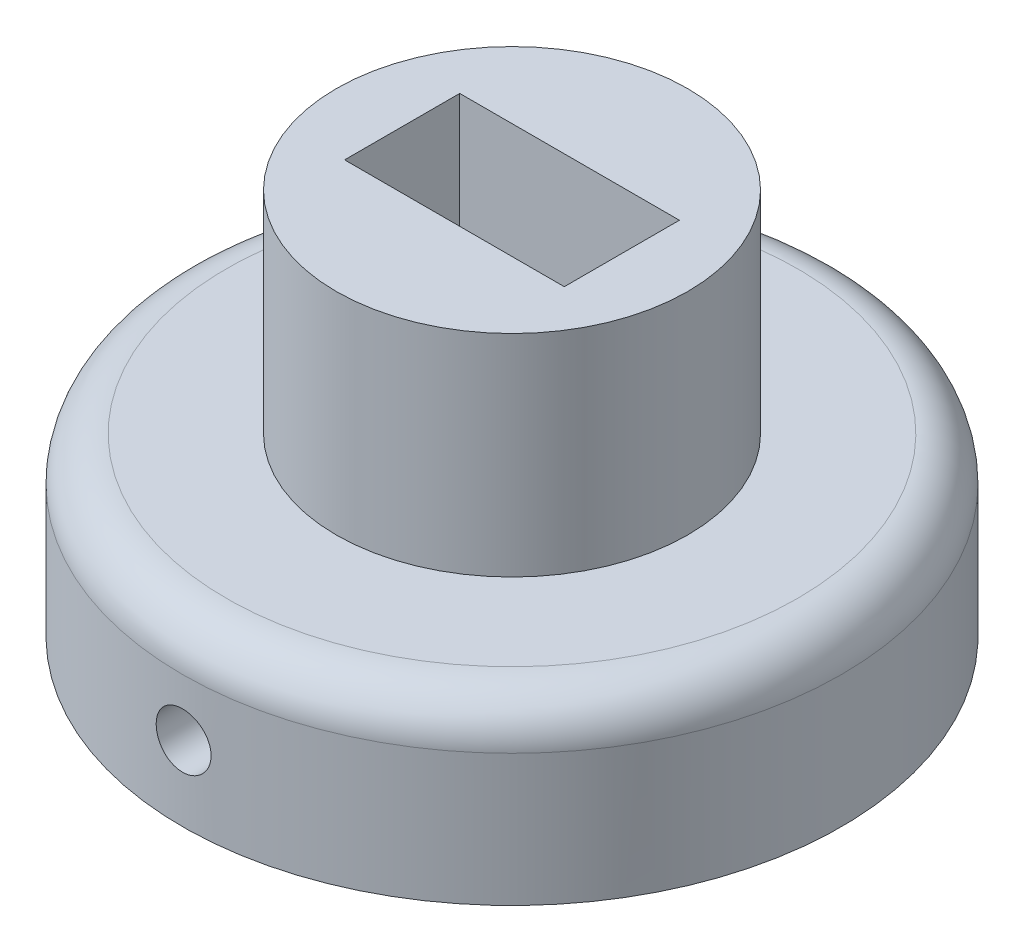
ISO-10303-21;
HEADER;
FILE_DESCRIPTION(('STEP AP214'),'2;1');
FILE_NAME('part.step','',(''),(''),'','','');
FILE_SCHEMA(('AUTOMOTIVE_DESIGN { 1 0 10303 214 1 1 1 1 }'));
ENDSEC;
DATA;
#1=APPLICATION_CONTEXT('core data for automotive mechanical design processes');
#2=APPLICATION_PROTOCOL_DEFINITION('international standard','automotive_design',2000,#1);
#3=PRODUCT_CONTEXT('',#1,'mechanical');
#4=PRODUCT('Part','Part','',(#3));
#5=PRODUCT_RELATED_PRODUCT_CATEGORY('part','',(#4));
#6=PRODUCT_DEFINITION_FORMATION('','',#4);
#7=PRODUCT_DEFINITION_CONTEXT('part definition',#1,'design');
#8=PRODUCT_DEFINITION('design','',#6,#7);
#9=PRODUCT_DEFINITION_SHAPE('','',#8);
#10=(LENGTH_UNIT() NAMED_UNIT(*) SI_UNIT(.MILLI.,.METRE.));
#11=(NAMED_UNIT(*) PLANE_ANGLE_UNIT() SI_UNIT($,.RADIAN.));
#12=(NAMED_UNIT(*) SI_UNIT($,.STERADIAN.) SOLID_ANGLE_UNIT());
#13=UNCERTAINTY_MEASURE_WITH_UNIT(LENGTH_MEASURE(1.E-05),#10,'distance_accuracy_value','');
#14=(GEOMETRIC_REPRESENTATION_CONTEXT(3) GLOBAL_UNCERTAINTY_ASSIGNED_CONTEXT((#13)) GLOBAL_UNIT_ASSIGNED_CONTEXT((#10,
#11,#12)) REPRESENTATION_CONTEXT('',''));
#15=CARTESIAN_POINT('',(0.,0.,0.));
#16=DIRECTION('',(0.,0.,1.));
#17=DIRECTION('',(1.,0.,0.));
#18=AXIS2_PLACEMENT_3D('',#15,#16,#17);
#19=CARTESIAN_POINT('',(0.,0.,0.));
#20=DIRECTION('',(0.,1.,0.));
#21=DIRECTION('',(-1.,0.,0.));
#22=AXIS2_PLACEMENT_3D('',#19,#20,#21);
#23=PLANE('',#22);
#24=DIRECTION('',(-0.500000000000001,0.,0.866025403784438));
#25=VECTOR('',#24,1.);
#26=CARTESIAN_POINT('',(6.45246660846326,0.,0.));
#27=LINE('',#26,#25);
#28=CARTESIAN_POINT('',(6.45246660846326,0.,0.));
#29=VERTEX_POINT('',#28);
#30=CARTESIAN_POINT('',(3.22623330423163,0.,5.588));
#31=VERTEX_POINT('',#30);
#32=EDGE_CURVE('E164',#29,#31,#27,.T.);
#33=ORIENTED_EDGE('',*,*,#32,.F.);
#34=DIRECTION('',(0.5,0.,0.866025403784439));
#35=VECTOR('',#34,1.);
#36=CARTESIAN_POINT('',(3.22623330423163,0.,-5.588));
#37=LINE('',#36,#35);
#38=CARTESIAN_POINT('',(3.22623330423163,0.,-5.588));
#39=VERTEX_POINT('',#38);
#40=EDGE_CURVE('E140',#39,#29,#37,.T.);
#41=ORIENTED_EDGE('',*,*,#40,.F.);
#42=DIRECTION('',(1.,0.,0.));
#43=VECTOR('',#42,1.);
#44=CARTESIAN_POINT('',(-3.22623330423163,0.,-5.588));
#45=LINE('',#44,#43);
#46=CARTESIAN_POINT('',(-3.22623330423163,0.,-5.588));
#47=VERTEX_POINT('',#46);
#48=EDGE_CURVE('E147',#47,#39,#45,.T.);
#49=ORIENTED_EDGE('',*,*,#48,.F.);
#50=DIRECTION('',(0.5,0.,-0.866025403784439));
#51=VECTOR('',#50,1.);
#52=CARTESIAN_POINT('',(-6.45246660846326,0.,0.));
#53=LINE('',#52,#51);
#54=CARTESIAN_POINT('',(-6.45246660846326,0.,0.));
#55=VERTEX_POINT('',#54);
#56=EDGE_CURVE('E173',#55,#47,#53,.T.);
#57=ORIENTED_EDGE('',*,*,#56,.F.);
#58=DIRECTION('',(-0.5,0.,-0.866025403784439));
#59=VECTOR('',#58,1.);
#60=CARTESIAN_POINT('',(-3.22623330423163,0.,5.588));
#61=LINE('',#60,#59);
#62=CARTESIAN_POINT('',(-3.22623330423163,0.,5.588));
#63=VERTEX_POINT('',#62);
#64=EDGE_CURVE('E170',#63,#55,#61,.T.);
#65=ORIENTED_EDGE('',*,*,#64,.F.);
#66=DIRECTION('',(-1.,0.,0.));
#67=VECTOR('',#66,1.);
#68=CARTESIAN_POINT('',(3.22623330423163,0.,5.588));
#69=LINE('',#68,#67);
#70=EDGE_CURVE('E167',#31,#63,#69,.T.);
#71=ORIENTED_EDGE('',*,*,#70,.F.);
#72=EDGE_LOOP('',(#33,#41,#49,#57,#65,#71));
#73=FACE_BOUND('',#72,.T.);
#74=CARTESIAN_POINT('',(0.,0.,0.));
#75=DIRECTION('',(0.,1.,0.));
#76=DIRECTION('',(-1.,0.,0.));
#77=AXIS2_PLACEMENT_3D('',#74,#75,#76);
#78=CIRCLE('',#77,9.525);
#79=CARTESIAN_POINT('',(-9.525,0.,0.));
#80=VERTEX_POINT('',#79);
#81=EDGE_CURVE('E196',#80,#80,#78,.T.);
#82=ORIENTED_EDGE('',*,*,#81,.F.);
#83=EDGE_LOOP('',(#82));
#84=FACE_BOUND('',#83,.T.);
#85=ADVANCED_FACE('F37',(#73,#84),#23,.F.);
#86=CARTESIAN_POINT('',(0.,11.176,0.));
#87=DIRECTION('',(0.,1.,0.));
#88=DIRECTION('',(-1.,0.,0.));
#89=AXIS2_PLACEMENT_3D('',#86,#87,#88);
#90=CYLINDRICAL_SURFACE('',#89,9.525);
#91=CARTESIAN_POINT('',(0.,3.80999999999997,0.));
#92=DIRECTION('',(0.,-1.,0.));
#93=DIRECTION('',(1.,0.,0.));
#94=AXIS2_PLACEMENT_3D('',#91,#92,#93);
#95=CIRCLE('',#94,9.525);
#96=CARTESIAN_POINT('',(9.525,3.80999999999997,0.));
#97=VERTEX_POINT('',#96);
#98=EDGE_CURVE('E11',#97,#97,#95,.T.);
#99=ORIENTED_EDGE('',*,*,#98,.T.);
#100=EDGE_LOOP('',(#99));
#101=FACE_BOUND('',#100,.T.);
#102=CARTESIAN_POINT('',(0.,2.95275,-9.525));
#103=CARTESIAN_POINT('',(-0.0445024588749559,2.95274805624414,-9.52499956670391));
#104=CARTESIAN_POINT('',(-0.0890352130743041,2.94899479271248,-9.52468479031321));
#105=CARTESIAN_POINT('',(-0.176868590493434,2.93407754571503,-9.52345934973048));
#106=CARTESIAN_POINT('',(-0.220167759772526,2.92290516644548,-9.52254801045783));
#107=CARTESIAN_POINT('',(-0.304249155370695,2.89347500916381,-9.52023242989095));
#108=CARTESIAN_POINT('',(-0.345032790712039,2.87522124018783,-9.51882846753173));
#109=CARTESIAN_POINT('',(-0.42294749152401,2.8321536322016,-9.51568508772365));
#110=CARTESIAN_POINT('',(-0.460079335971527,2.80734119642723,-9.51394574205203));
#111=CARTESIAN_POINT('',(-0.529740812472688,2.75179229088149,-9.51032181519203));
#112=CARTESIAN_POINT('',(-0.562259854980328,2.72104256087605,-9.5084369146872));
#113=CARTESIAN_POINT('',(-0.62168177474464,2.65451995141912,-9.50473699762515));
#114=CARTESIAN_POINT('',(-0.648584405276133,2.61874685140979,-9.50292198414087));
#115=CARTESIAN_POINT('',(-0.696045663397244,2.54312886955265,-9.49956390549861));
#116=CARTESIAN_POINT('',(-0.716594986155287,2.50327812827405,-9.49802124061698));
#117=CARTESIAN_POINT('',(-0.750706869307989,2.42067691540244,-9.49538617530817));
#118=CARTESIAN_POINT('',(-0.764269553112981,2.37792649504376,-9.49429376692783));
#119=CARTESIAN_POINT('',(-0.78399245491849,2.29084553269432,-9.49268558077643));
#120=CARTESIAN_POINT('',(-0.790169921903133,2.24651892263087,-9.49216845955624));
#121=CARTESIAN_POINT('',(-0.795000321362246,2.15745520061837,-9.49176515030172));
#122=CARTESIAN_POINT('',(-0.793653395052509,2.11271809638908,-9.49187895042641));
#123=CARTESIAN_POINT('',(-0.783487498470536,2.02422151550102,-9.492723405308));
#124=CARTESIAN_POINT('',(-0.774687274630208,1.9804598685456,-9.49345251243671));
#125=CARTESIAN_POINT('',(-0.749893713397709,1.89503695525684,-9.49544300083183));
#126=CARTESIAN_POINT('',(-0.733900305752448,1.85337570944175,-9.49670438729682));
#127=CARTESIAN_POINT('',(-0.695153381845676,1.77327646845926,-9.49961908736064));
#128=CARTESIAN_POINT('',(-0.672391454901022,1.73484256028992,-9.50127288806078));
#129=CARTESIAN_POINT('',(-0.62075968360622,1.66233368731178,-9.50478562323205));
#130=CARTESIAN_POINT('',(-0.591889715556642,1.62825881080409,-9.50664456185725));
#131=CARTESIAN_POINT('',(-0.528756230892175,1.56532626094526,-9.51036499951743));
#132=CARTESIAN_POINT('',(-0.494476507703769,1.53648484284741,-9.51222648902709));
#133=CARTESIAN_POINT('',(-0.421553129120077,1.48496359456034,-9.51573687296681));
#134=CARTESIAN_POINT('',(-0.382909470809049,1.46228376848799,-9.51738576725483));
#135=CARTESIAN_POINT('',(-0.302344608406357,1.42373051338171,-9.52028548861401));
#136=CARTESIAN_POINT('',(-0.260423058185952,1.40785780429546,-9.52153627357596));
#137=CARTESIAN_POINT('',(-0.174497261034293,1.38338073236676,-9.52349836320615));
#138=CARTESIAN_POINT('',(-0.130493057346528,1.37477621867989,-9.52420967907053));
#139=CARTESIAN_POINT('',(-0.0417919695053741,1.365100168542,-9.52501124698546));
#140=CARTESIAN_POINT('',(0.00290244936018692,1.36400617937765,-9.52510335015527));
#141=CARTESIAN_POINT('',(0.0918390597994971,1.36932341437293,-9.52466105905593));
#142=CARTESIAN_POINT('',(0.136081255587622,1.37573456852588,-9.5241266706306));
#143=CARTESIAN_POINT('',(0.222793525253355,1.39586149152176,-9.52249268536548));
#144=CARTESIAN_POINT('',(0.265266031204654,1.40956685322049,-9.52139389387578));
#145=CARTESIAN_POINT('',(0.347308618534226,1.44388251655199,-9.51875453776679));
#146=CARTESIAN_POINT('',(0.386878654012236,1.46449292735393,-9.51721396616298));
#147=CARTESIAN_POINT('',(0.462095229527139,1.51209005844048,-9.51385913449945));
#148=CARTESIAN_POINT('',(0.497732328226416,1.53909165320089,-9.51204423961122));
#149=CARTESIAN_POINT('',(0.563976119032124,1.59868318903382,-9.5083467967026));
#150=CARTESIAN_POINT('',(0.594582723721417,1.63127322719911,-9.50646424750724));
#151=CARTESIAN_POINT('',(0.649973732954987,1.70121396818243,-9.50283819215059));
#152=CARTESIAN_POINT('',(0.6747434857542,1.73857629582544,-9.50109504300164));
#153=CARTESIAN_POINT('',(0.717657206128867,1.81694317114784,-9.49795020447055));
#154=CARTESIAN_POINT('',(0.735801239857908,1.85794768245726,-9.49654851167922));
#155=CARTESIAN_POINT('',(0.764923522093448,1.94238307749052,-9.49424729011346));
#156=CARTESIAN_POINT('',(0.775910739775374,1.985810849867,-9.49334713300228));
#157=CARTESIAN_POINT('',(0.790436704866184,2.07390261802532,-9.49214879642113));
#158=CARTESIAN_POINT('',(0.793975595313561,2.11856659005037,-9.49185060539094));
#159=CARTESIAN_POINT('',(0.793502796794676,2.20771730002909,-9.49189013122967));
#160=CARTESIAN_POINT('',(0.789514129135804,2.25220416274392,-9.49222590925124));
#161=CARTESIAN_POINT('',(0.77414744149043,2.33987382350599,-9.49349141971581));
#162=CARTESIAN_POINT('',(0.762769410233804,2.38305661956417,-9.49442115306469));
#163=CARTESIAN_POINT('',(0.732952806076043,2.46689384959288,-9.49676930598291));
#164=CARTESIAN_POINT('',(0.714514647617685,2.50754843181152,-9.49818769686663));
#165=CARTESIAN_POINT('',(0.671103765539379,2.58518885470535,-9.50135339275837));
#166=CARTESIAN_POINT('',(0.64613114448468,2.62217475295183,-9.50310069260369));
#167=CARTESIAN_POINT('',(0.590273729059693,2.69154571784158,-9.50673368285828));
#168=CARTESIAN_POINT('',(0.559371891907283,2.72391704124677,-9.50861976229559));
#169=CARTESIAN_POINT('',(0.49256412281402,2.78302655325513,-9.51231424788933));
#170=CARTESIAN_POINT('',(0.456656981846367,2.80976337691871,-9.51412263514079));
#171=CARTESIAN_POINT('',(0.380788682342098,2.85688076420644,-9.51746123906055));
#172=CARTESIAN_POINT('',(0.34082010216474,2.87724940380846,-9.51899093168339));
#173=CARTESIAN_POINT('',(0.258044753146613,2.91096049367195,-9.52159364184813));
#174=CARTESIAN_POINT('',(0.215241310859585,2.92431102040368,-9.52266718405553));
#175=CARTESIAN_POINT('',(0.143487813176739,2.940206831111,-9.52396104263744));
#176=CARTESIAN_POINT('',(0.114999209960536,2.94490426743576,-9.52434887796081));
#177=CARTESIAN_POINT('',(0.0576779798790479,2.95117647768128,-9.5248684967279));
#178=CARTESIAN_POINT('',(0.0288453539273546,2.95275125989276,-9.52500028085143));
#179=CARTESIAN_POINT('',(0.,2.95275,-9.525));
#180=B_SPLINE_CURVE_WITH_KNOTS('',3,(#102,#103,#104,#105,#106,#107,#108,#109,#110,#111,#112,
#113,#114,#115,#116,#117,#118,#119,#120,#121,#122,#123,#124,#125,#126,#127,#128,#129,#130,#131,
#132,#133,#134,#135,#136,#137,#138,#139,#140,#141,#142,#143,#144,#145,#146,#147,#148,#149,#150,
#151,#152,#153,#154,#155,#156,#157,#158,#159,#160,#161,#162,#163,#164,#165,#166,#167,#168,#169,
#170,#171,#172,#173,#174,#175,#176,#177,#178,#179),.UNSPECIFIED.,.T.,.F.,(4,2,2,2,2,2,2,2,2,2,2,
2,2,2,2,2,2,2,2,2,2,2,2,2,2,2,2,2,2,2,2,2,2,2,2,2,2,2,4),(0.,0.13340205952261,0.266955340642032,
0.400433122399358,0.533882369482444,0.667633180848701,0.801389866561832,0.935341529674287,
1.06929082661521,1.20292665522572,1.33655997580329,1.46985817843792,1.60315768297368,
1.73662352500689,1.87009207023558,2.00396832929775,2.13784467780924,2.2717351821242,
2.405622907602,2.53911020075065,2.67259624876288,2.80589235168186,2.93919056211839,
3.07280210761348,3.20641597469055,3.34036175089892,3.47430618970738,3.60808243997487,
3.74185612116514,3.87522134913006,4.0085867805017,4.14194438427096,4.27529989497823,
4.40904462252557,4.54282171215781,4.67684781118402,4.8107193329473,4.897187360456,
4.98365515839005),.UNSPECIFIED.);
#181=CARTESIAN_POINT('',(0.,2.95275,-9.525));
#182=VERTEX_POINT('',#181);
#183=EDGE_CURVE('E246',#182,#182,#180,.T.);
#184=ORIENTED_EDGE('',*,*,#183,.T.);
#185=EDGE_LOOP('',(#184));
#186=FACE_BOUND('',#185,.T.);
#187=CARTESIAN_POINT('',(0.79375,2.159,9.49186946483674));
#188=CARTESIAN_POINT('',(0.793748055971614,2.11449784364762,9.49186990376637));
#189=CARTESIAN_POINT('',(0.789994841743108,2.06996539098734,9.49218580336204));
#190=CARTESIAN_POINT('',(0.775077808390216,1.9821326401024,9.4934152567598));
#191=CARTESIAN_POINT('',(0.763905592424564,1.93883379605496,9.49432948773761));
#192=CARTESIAN_POINT('',(0.734475912885411,1.85475308807552,9.49665134174957));
#193=CARTESIAN_POINT('',(0.716222466123075,1.813969812367,9.49805868502322));
#194=CARTESIAN_POINT('',(0.673155616860331,1.73605571380213,9.50120784144409));
#195=CARTESIAN_POINT('',(0.648343616801324,1.69892411242006,9.50294958306382));
#196=CARTESIAN_POINT('',(0.592795150813565,1.62926236006585,9.50657630668715));
#197=CARTESIAN_POINT('',(0.56204532736274,1.59674287595877,9.50846160572916));
#198=CARTESIAN_POINT('',(0.495522345786649,1.53732010429857,9.51216011434801));
#199=CARTESIAN_POINT('',(0.459748968306357,1.51041706211673,9.51397332077246));
#200=CARTESIAN_POINT('',(0.384130744713852,1.46295537461665,9.51732634652841));
#201=CARTESIAN_POINT('',(0.344280086874901,1.44240595822472,9.51886576680833));
#202=CARTESIAN_POINT('',(0.261679055395893,1.40829387892469,9.52149435369253));
#203=CARTESIAN_POINT('',(0.218928732525328,1.39473109372517,9.5225835281777));
#204=CARTESIAN_POINT('',(0.131848063033575,1.37500797843927,9.52418668765556));
#205=CARTESIAN_POINT('',(0.0875216501344051,1.36883039104894,9.52470201339087));
#206=CARTESIAN_POINT('',(-0.00154168625004403,1.36399968247223,9.52510395532792));
#207=CARTESIAN_POINT('',(-0.0462786020860167,1.36534642136076,9.52499058322115));
#208=CARTESIAN_POINT('',(-0.134776012768059,1.37551202241738,9.5241490098204));
#209=CARTESIAN_POINT('',(-0.17853865587002,1.38431232678208,9.52342233553507));
#210=CARTESIAN_POINT('',(-0.263963519919445,1.40910639482616,9.52143764884605));
#211=CARTESIAN_POINT('',(-0.305625720878005,1.42510022694852,9.52017963138687));
#212=CARTESIAN_POINT('',(-0.385726115005505,1.46384802727536,9.51727116030383));
#213=CARTESIAN_POINT('',(-0.424160269485561,1.48661030671277,9.51562022470132));
#214=CARTESIAN_POINT('',(-0.496669485352663,1.53824282900303,9.51211144682469));
#215=CARTESIAN_POINT('',(-0.530744458297085,1.56711319575021,9.51025360035402));
#216=CARTESIAN_POINT('',(-0.593676553295631,1.63024696171448,9.50653312643144));
#217=CARTESIAN_POINT('',(-0.622517500727865,1.66452648648743,9.50467050161177));
#218=CARTESIAN_POINT('',(-0.674037894144897,1.73744930093608,9.50115608156825));
#219=CARTESIAN_POINT('',(-0.696717335050538,1.77609259420897,9.4995042865182));
#220=CARTESIAN_POINT('',(-0.735270313645894,1.85665736091887,9.49659824464482));
#221=CARTESIAN_POINT('',(-0.751143011883169,1.8985792379391,9.49534404686078));
#222=CARTESIAN_POINT('',(-0.775619961828879,1.98450574495298,9.49337615290986));
#223=CARTESIAN_POINT('',(-0.784224366345249,2.0285103311394,9.49266244537979));
#224=CARTESIAN_POINT('',(-0.79390000518689,2.11721159182826,9.49185818236624));
#225=CARTESIAN_POINT('',(-0.794993795231073,2.16190578972347,9.49176576106666));
#226=CARTESIAN_POINT('',(-0.789676240879327,2.25084191027189,9.49220960975968));
#227=CARTESIAN_POINT('',(-0.783264966486064,2.29508383713974,9.4927458738883));
#228=CARTESIAN_POINT('',(-0.763138079736218,2.38179479491589,9.49438496839893));
#229=CARTESIAN_POINT('',(-0.749432993597876,2.42426628585821,9.49548698222649));
#230=CARTESIAN_POINT('',(-0.715118221644935,2.50630696521747,9.49813272915068));
#231=CARTESIAN_POINT('',(-0.694508425041734,2.54587610705275,9.49967646933491));
#232=CARTESIAN_POINT('',(-0.64691219358329,2.62109208144904,9.50303625061403));
#233=CARTESIAN_POINT('',(-0.619910728112498,2.65672937379125,9.50485292981518));
#234=CARTESIAN_POINT('',(-0.560319339429809,2.7229736155948,9.50855173607938));
#235=CARTESIAN_POINT('',(-0.527729320054606,2.75358047847884,9.51043386426818));
#236=CARTESIAN_POINT('',(-0.457788464748696,2.80897203457997,9.51405705380132));
#237=CARTESIAN_POINT('',(-0.420426000975302,2.83374207269623,9.51579775302222));
#238=CARTESIAN_POINT('',(-0.342058778363933,2.87665629389186,9.51893673322652));
#239=CARTESIAN_POINT('',(-0.301054055928035,2.89480054318254,9.52033501763161));
#240=CARTESIAN_POINT('',(-0.216618803146336,2.92392297041776,9.52262995155359));
#241=CARTESIAN_POINT('',(-0.173191416475731,2.93491021089701,9.52352723525412));
#242=CARTESIAN_POINT('',(-0.0851004608838743,2.94943635231731,9.52472164243053));
#243=CARTESIAN_POINT('',(-0.040436915377776,2.95297539424344,9.52501877726648));
#244=CARTESIAN_POINT('',(0.0487140634142476,2.95250303294173,9.52497942499496));
#245=CARTESIAN_POINT('',(0.0932016203427882,2.94851446916566,9.52464485453844));
#246=CARTESIAN_POINT('',(0.180872695198684,2.93314774485647,9.52338347570212));
#247=CARTESIAN_POINT('',(0.224056211354773,2.92176957428658,9.52245666651792));
#248=CARTESIAN_POINT('',(0.307894868118696,2.89195242496537,9.52011479977499));
#249=CARTESIAN_POINT('',(0.348550155482956,2.87351385649541,9.51869977058731));
#250=CARTESIAN_POINT('',(0.426191817238599,2.83010193646559,9.51553976968878));
#251=CARTESIAN_POINT('',(0.463178249637058,2.80512868824614,9.51379480319573));
#252=CARTESIAN_POINT('',(0.532549170981458,2.74927058821354,9.51016448310669));
#253=CARTESIAN_POINT('',(0.564920031562788,2.71836883669368,9.50827873782952));
#254=CARTESIAN_POINT('',(0.624028649831638,2.65156142857377,9.50458272578044));
#255=CARTESIAN_POINT('',(0.650765041374533,2.6156545619217,9.50277247739882));
#256=CARTESIAN_POINT('',(0.697881969564467,2.53978648069363,9.49942874374388));
#257=CARTESIAN_POINT('',(0.718250502995158,2.49981779531152,9.49789578341389));
#258=CARTESIAN_POINT('',(0.7519613651162,2.4170422220919,9.49528660061675));
#259=CARTESIAN_POINT('',(0.765311771800265,2.37423866145632,9.49420985331826));
#260=CARTESIAN_POINT('',(0.781207240292331,2.30248548564467,9.49291192749276));
#261=CARTESIAN_POINT('',(0.785904522658884,2.27399734685701,9.49252280108811));
#262=CARTESIAN_POINT('',(0.792176528345911,2.21667704747996,9.49200142785512));
#263=CARTESIAN_POINT('',(0.793751260057608,2.18784488781526,9.49186918033646));
#264=CARTESIAN_POINT('',(0.79375,2.159,9.49186946483674));
#265=B_SPLINE_CURVE_WITH_KNOTS('',3,(#187,#188,#189,#190,#191,#192,#193,#194,#195,#196,#197,
#198,#199,#200,#201,#202,#203,#204,#205,#206,#207,#208,#209,#210,#211,#212,#213,#214,#215,#216,
#217,#218,#219,#220,#221,#222,#223,#224,#225,#226,#227,#228,#229,#230,#231,#232,#233,#234,#235,
#236,#237,#238,#239,#240,#241,#242,#243,#244,#245,#246,#247,#248,#249,#250,#251,#252,#253,#254,
#255,#256,#257,#258,#259,#260,#261,#262,#263,#264),.UNSPECIFIED.,.T.,.F.,(4,2,2,2,2,2,2,2,2,2,2,
2,2,2,2,2,2,2,2,2,2,2,2,2,2,2,2,2,2,2,2,2,2,2,2,2,2,2,4),(0.,0.133401150877659,
0.266953543369256,0.400430289099396,0.533878516025936,0.667630516314075,0.801388358741387,
0.935339587442498,1.06928847143099,1.2029237357373,1.3365565149222,1.46985755148967,
1.60315985638005,1.73662652897048,1.87009590901209,2.00397097318102,2.13784614770773,
2.27173782785988,2.40562669301565,2.53911328941239,2.67259864073745,2.80589187018534,
2.9391872384742,3.07279923319135,3.20641352722619,3.34035980816231,3.47430475054048,
3.60807975424297,3.74185222572935,3.87521947155307,4.0085868985201,4.14194657665058,
4.27530414593823,4.40904766781932,4.54282358020796,4.67685015652607,4.81072212611861,
4.89718875801907,4.98365515755762),.UNSPECIFIED.);
#266=CARTESIAN_POINT('',(0.79375,2.159,9.49186946483674));
#267=VERTEX_POINT('',#266);
#268=EDGE_CURVE('E240',#267,#267,#265,.T.);
#269=ORIENTED_EDGE('',*,*,#268,.T.);
#270=EDGE_LOOP('',(#269));
#271=FACE_BOUND('',#270,.T.);
#272=ORIENTED_EDGE('',*,*,#81,.T.);
#273=EDGE_LOOP('',(#272));
#274=FACE_BOUND('',#273,.T.);
#275=ADVANCED_FACE('F226',(#101,#186,#271,#274),#90,.T.);
#276=CARTESIAN_POINT('',(9.525,5.07999999999997,0.));
#277=DIRECTION('',(0.,-1.,0.));
#278=DIRECTION('',(1.,0.,0.));
#279=AXIS2_PLACEMENT_3D('',#276,#277,#278);
#280=PLANE('',#279);
#281=CARTESIAN_POINT('',(0.,5.07999999999997,0.));
#282=DIRECTION('',(0.,-1.,0.));
#283=DIRECTION('',(1.,0.,0.));
#284=AXIS2_PLACEMENT_3D('',#281,#282,#283);
#285=CIRCLE('',#284,8.255);
#286=CARTESIAN_POINT('',(8.255,5.07999999999997,0.));
#287=VERTEX_POINT('',#286);
#288=EDGE_CURVE('E45',#287,#287,#285,.F.);
#289=ORIENTED_EDGE('',*,*,#288,.T.);
#290=EDGE_LOOP('',(#289));
#291=FACE_BOUND('',#290,.T.);
#292=CARTESIAN_POINT('',(0.,5.07999999999997,0.));
#293=DIRECTION('',(0.,1.,0.));
#294=DIRECTION('',(-1.,0.,0.));
#295=AXIS2_PLACEMENT_3D('',#292,#293,#294);
#296=CIRCLE('',#295,5.08);
#297=CARTESIAN_POINT('',(-5.08,5.07999999999997,0.));
#298=VERTEX_POINT('',#297);
#299=EDGE_CURVE('E193',#298,#298,#296,.T.);
#300=ORIENTED_EDGE('',*,*,#299,.F.);
#301=EDGE_LOOP('',(#300));
#302=FACE_BOUND('',#301,.T.);
#303=ADVANCED_FACE('F212',(#291,#302),#280,.F.);
#304=CARTESIAN_POINT('',(0.,11.176,0.));
#305=DIRECTION('',(0.,1.,0.));
#306=DIRECTION('',(-1.,0.,0.));
#307=AXIS2_PLACEMENT_3D('',#304,#305,#306);
#308=CYLINDRICAL_SURFACE('',#307,5.08);
#309=CARTESIAN_POINT('',(0.,11.176,0.));
#310=DIRECTION('',(0.,1.,0.));
#311=DIRECTION('',(-1.,0.,0.));
#312=AXIS2_PLACEMENT_3D('',#309,#310,#311);
#313=CIRCLE('',#312,5.08);
#314=CARTESIAN_POINT('',(-5.08,11.176,0.));
#315=VERTEX_POINT('',#314);
#316=EDGE_CURVE('E180',#315,#315,#313,.T.);
#317=ORIENTED_EDGE('',*,*,#316,.F.);
#318=EDGE_LOOP('',(#317));
#319=FACE_BOUND('',#318,.T.);
#320=ORIENTED_EDGE('',*,*,#299,.T.);
#321=EDGE_LOOP('',(#320));
#322=FACE_BOUND('',#321,.T.);
#323=ADVANCED_FACE('F294',(#319,#322),#308,.T.);
#324=CARTESIAN_POINT('',(5.08,11.176,0.));
#325=DIRECTION('',(0.,-1.,0.));
#326=DIRECTION('',(1.,0.,0.));
#327=AXIS2_PLACEMENT_3D('',#324,#325,#326);
#328=PLANE('',#327);
#329=DIRECTION('',(-1.,0.,0.));
#330=VECTOR('',#329,1.);
#331=CARTESIAN_POINT('',(-3.175,11.176,-1.6637));
#332=LINE('',#331,#330);
#333=CARTESIAN_POINT('',(3.175,11.176,-1.6637));
#334=VERTEX_POINT('',#333);
#335=CARTESIAN_POINT('',(-3.175,11.176,-1.6637));
#336=VERTEX_POINT('',#335);
#337=EDGE_CURVE('E126',#334,#336,#332,.T.);
#338=ORIENTED_EDGE('',*,*,#337,.F.);
#339=DIRECTION('',(0.,0.,-1.));
#340=VECTOR('',#339,1.);
#341=CARTESIAN_POINT('',(3.175,11.176,1.6637));
#342=LINE('',#341,#340);
#343=CARTESIAN_POINT('',(3.175,11.176,1.6637));
#344=VERTEX_POINT('',#343);
#345=EDGE_CURVE('E52',#344,#334,#342,.T.);
#346=ORIENTED_EDGE('',*,*,#345,.F.);
#347=DIRECTION('',(1.,0.,0.));
#348=VECTOR('',#347,1.);
#349=CARTESIAN_POINT('',(-3.175,11.176,1.6637));
#350=LINE('',#349,#348);
#351=CARTESIAN_POINT('',(-3.175,11.176,1.6637));
#352=VERTEX_POINT('',#351);
#353=EDGE_CURVE('E133',#352,#344,#350,.T.);
#354=ORIENTED_EDGE('',*,*,#353,.F.);
#355=DIRECTION('',(0.,0.,1.));
#356=VECTOR('',#355,1.);
#357=CARTESIAN_POINT('',(-3.175,11.176,1.6637));
#358=LINE('',#357,#356);
#359=EDGE_CURVE('E117',#336,#352,#358,.T.);
#360=ORIENTED_EDGE('',*,*,#359,.F.);
#361=EDGE_LOOP('',(#338,#346,#354,#360));
#362=FACE_BOUND('',#361,.T.);
#363=ORIENTED_EDGE('',*,*,#316,.T.);
#364=EDGE_LOOP('',(#363));
#365=FACE_BOUND('',#364,.T.);
#366=ADVANCED_FACE('F130',(#362,#365),#328,.F.);
#367=CARTESIAN_POINT('',(3.22623330423163,4.318,-5.588));
#368=DIRECTION('',(0.866025403784439,0.,-0.5));
#369=DIRECTION('',(-0.5,0.,-0.866025403784439));
#370=AXIS2_PLACEMENT_3D('',#367,#368,#369);
#371=PLANE('',#370);
#372=ORIENTED_EDGE('',*,*,#40,.T.);
#373=DIRECTION('',(0.,-1.,0.));
#374=VECTOR('',#373,1.);
#375=CARTESIAN_POINT('',(6.45246660846326,4.318,0.));
#376=LINE('',#375,#374);
#377=CARTESIAN_POINT('',(6.45246660846326,4.318,0.));
#378=VERTEX_POINT('',#377);
#379=EDGE_CURVE('E162',#378,#29,#376,.T.);
#380=ORIENTED_EDGE('',*,*,#379,.F.);
#381=DIRECTION('',(0.5,0.,0.866025403784439));
#382=VECTOR('',#381,1.);
#383=CARTESIAN_POINT('',(3.22623330423163,4.318,-5.588));
#384=LINE('',#383,#382);
#385=CARTESIAN_POINT('',(3.22623330423163,4.318,-5.588));
#386=VERTEX_POINT('',#385);
#387=EDGE_CURVE('E143',#386,#378,#384,.T.);
#388=ORIENTED_EDGE('',*,*,#387,.F.);
#389=DIRECTION('',(0.,-1.,0.));
#390=VECTOR('',#389,1.);
#391=CARTESIAN_POINT('',(3.22623330423163,4.318,-5.588));
#392=LINE('',#391,#390);
#393=EDGE_CURVE('E178',#386,#39,#392,.T.);
#394=ORIENTED_EDGE('',*,*,#393,.T.);
#395=EDGE_LOOP('',(#372,#380,#388,#394));
#396=FACE_BOUND('',#395,.T.);
#397=ADVANCED_FACE('F274',(#396),#371,.F.);
#398=CARTESIAN_POINT('',(-3.22623330423163,4.318,-5.588));
#399=DIRECTION('',(0.,0.,-1.));
#400=DIRECTION('',(-1.,0.,0.));
#401=AXIS2_PLACEMENT_3D('',#398,#399,#400);
#402=PLANE('',#401);
#403=CARTESIAN_POINT('',(0.,2.159,-5.588));
#404=DIRECTION('',(0.,0.,-1.));
#405=DIRECTION('',(-1.,0.,0.));
#406=AXIS2_PLACEMENT_3D('',#403,#404,#405);
#407=CIRCLE('',#406,0.79375);
#408=CARTESIAN_POINT('',(-0.79375,2.159,-5.588));
#409=VERTEX_POINT('',#408);
#410=EDGE_CURVE('E208',#409,#409,#407,.T.);
#411=ORIENTED_EDGE('',*,*,#410,.T.);
#412=EDGE_LOOP('',(#411));
#413=FACE_BOUND('',#412,.T.);
#414=ORIENTED_EDGE('',*,*,#48,.T.);
#415=ORIENTED_EDGE('',*,*,#393,.F.);
#416=DIRECTION('',(1.,0.,0.));
#417=VECTOR('',#416,1.);
#418=CARTESIAN_POINT('',(-3.22623330423163,4.318,-5.588));
#419=LINE('',#418,#417);
#420=CARTESIAN_POINT('',(-3.22623330423163,4.318,-5.588));
#421=VERTEX_POINT('',#420);
#422=EDGE_CURVE('E159',#421,#386,#419,.T.);
#423=ORIENTED_EDGE('',*,*,#422,.F.);
#424=DIRECTION('',(0.,-1.,0.));
#425=VECTOR('',#424,1.);
#426=CARTESIAN_POINT('',(-3.22623330423163,4.318,-5.588));
#427=LINE('',#426,#425);
#428=EDGE_CURVE('E181',#421,#47,#427,.T.);
#429=ORIENTED_EDGE('',*,*,#428,.T.);
#430=EDGE_LOOP('',(#414,#415,#423,#429));
#431=FACE_BOUND('',#430,.T.);
#432=ADVANCED_FACE('F270',(#413,#431),#402,.F.);
#433=CARTESIAN_POINT('',(-6.45246660846326,4.318,0.));
#434=DIRECTION('',(-0.866025403784439,0.,-0.5));
#435=DIRECTION('',(-0.5,0.,0.866025403784439));
#436=AXIS2_PLACEMENT_3D('',#433,#434,#435);
#437=PLANE('',#436);
#438=ORIENTED_EDGE('',*,*,#56,.T.);
#439=ORIENTED_EDGE('',*,*,#428,.F.);
#440=DIRECTION('',(0.5,0.,-0.866025403784439));
#441=VECTOR('',#440,1.);
#442=CARTESIAN_POINT('',(-6.45246660846326,4.318,0.));
#443=LINE('',#442,#441);
#444=CARTESIAN_POINT('',(-6.45246660846326,4.318,0.));
#445=VERTEX_POINT('',#444);
#446=EDGE_CURVE('E156',#445,#421,#443,.T.);
#447=ORIENTED_EDGE('',*,*,#446,.F.);
#448=DIRECTION('',(0.,-1.,0.));
#449=VECTOR('',#448,1.);
#450=CARTESIAN_POINT('',(-6.45246660846326,4.318,0.));
#451=LINE('',#450,#449);
#452=EDGE_CURVE('E183',#445,#55,#451,.T.);
#453=ORIENTED_EDGE('',*,*,#452,.T.);
#454=EDGE_LOOP('',(#438,#439,#447,#453));
#455=FACE_BOUND('',#454,.T.);
#456=ADVANCED_FACE('F273',(#455),#437,.F.);
#457=CARTESIAN_POINT('',(-3.22623330423163,4.318,5.588));
#458=DIRECTION('',(-0.866025403784439,0.,0.5));
#459=DIRECTION('',(0.5,0.,0.866025403784439));
#460=AXIS2_PLACEMENT_3D('',#457,#458,#459);
#461=PLANE('',#460);
#462=ORIENTED_EDGE('',*,*,#64,.T.);
#463=ORIENTED_EDGE('',*,*,#452,.F.);
#464=DIRECTION('',(-0.5,0.,-0.866025403784439));
#465=VECTOR('',#464,1.);
#466=CARTESIAN_POINT('',(-3.22623330423163,4.318,5.588));
#467=LINE('',#466,#465);
#468=CARTESIAN_POINT('',(-3.22623330423163,4.318,5.588));
#469=VERTEX_POINT('',#468);
#470=EDGE_CURVE('E153',#469,#445,#467,.T.);
#471=ORIENTED_EDGE('',*,*,#470,.F.);
#472=DIRECTION('',(0.,-1.,0.));
#473=VECTOR('',#472,1.);
#474=CARTESIAN_POINT('',(-3.22623330423163,4.318,5.588));
#475=LINE('',#474,#473);
#476=EDGE_CURVE('E185',#469,#63,#475,.T.);
#477=ORIENTED_EDGE('',*,*,#476,.T.);
#478=EDGE_LOOP('',(#462,#463,#471,#477));
#479=FACE_BOUND('',#478,.T.);
#480=ADVANCED_FACE('F278',(#479),#461,.F.);
#481=CARTESIAN_POINT('',(3.22623330423163,4.318,5.588));
#482=DIRECTION('',(0.,0.,1.));
#483=DIRECTION('',(1.,0.,0.));
#484=AXIS2_PLACEMENT_3D('',#481,#482,#483);
#485=PLANE('',#484);
#486=CARTESIAN_POINT('',(0.,2.159,5.588));
#487=DIRECTION('',(0.,0.,1.));
#488=DIRECTION('',(1.,0.,0.));
#489=AXIS2_PLACEMENT_3D('',#486,#487,#488);
#490=CIRCLE('',#489,0.79375);
#491=CARTESIAN_POINT('',(0.79375,2.159,5.588));
#492=VERTEX_POINT('',#491);
#493=EDGE_CURVE('E206',#492,#492,#490,.T.);
#494=ORIENTED_EDGE('',*,*,#493,.T.);
#495=EDGE_LOOP('',(#494));
#496=FACE_BOUND('',#495,.T.);
#497=ORIENTED_EDGE('',*,*,#70,.T.);
#498=ORIENTED_EDGE('',*,*,#476,.F.);
#499=DIRECTION('',(-1.,0.,0.));
#500=VECTOR('',#499,1.);
#501=CARTESIAN_POINT('',(3.22623330423163,4.318,5.588));
#502=LINE('',#501,#500);
#503=CARTESIAN_POINT('',(3.22623330423163,4.318,5.588));
#504=VERTEX_POINT('',#503);
#505=EDGE_CURVE('E150',#504,#469,#502,.T.);
#506=ORIENTED_EDGE('',*,*,#505,.F.);
#507=DIRECTION('',(0.,-1.,0.));
#508=VECTOR('',#507,1.);
#509=CARTESIAN_POINT('',(3.22623330423163,4.318,5.588));
#510=LINE('',#509,#508);
#511=EDGE_CURVE('E187',#504,#31,#510,.T.);
#512=ORIENTED_EDGE('',*,*,#511,.T.);
#513=EDGE_LOOP('',(#497,#498,#506,#512));
#514=FACE_BOUND('',#513,.T.);
#515=ADVANCED_FACE('F282',(#496,#514),#485,.F.);
#516=CARTESIAN_POINT('',(6.45246660846326,4.318,0.));
#517=DIRECTION('',(0.866025403784438,0.,0.500000000000001));
#518=DIRECTION('',(0.500000000000001,0.,-0.866025403784438));
#519=AXIS2_PLACEMENT_3D('',#516,#517,#518);
#520=PLANE('',#519);
#521=ORIENTED_EDGE('',*,*,#32,.T.);
#522=ORIENTED_EDGE('',*,*,#511,.F.);
#523=DIRECTION('',(-0.500000000000001,0.,0.866025403784438));
#524=VECTOR('',#523,1.);
#525=CARTESIAN_POINT('',(6.45246660846326,4.318,0.));
#526=LINE('',#525,#524);
#527=EDGE_CURVE('E146',#378,#504,#526,.T.);
#528=ORIENTED_EDGE('',*,*,#527,.F.);
#529=ORIENTED_EDGE('',*,*,#379,.T.);
#530=EDGE_LOOP('',(#521,#522,#528,#529));
#531=FACE_BOUND('',#530,.T.);
#532=ADVANCED_FACE('F268',(#531),#520,.F.);
#533=CARTESIAN_POINT('',(0.,4.318,0.));
#534=DIRECTION('',(0.,-1.,0.));
#535=DIRECTION('',(1.,0.,0.));
#536=AXIS2_PLACEMENT_3D('',#533,#534,#535);
#537=PLANE('',#536);
#538=DIRECTION('',(0.,0.,1.));
#539=VECTOR('',#538,1.);
#540=CARTESIAN_POINT('',(3.175,4.318,0.));
#541=LINE('',#540,#539);
#542=CARTESIAN_POINT('',(3.175,4.318,-1.6637));
#543=VERTEX_POINT('',#542);
#544=CARTESIAN_POINT('',(3.175,4.318,1.6637));
#545=VERTEX_POINT('',#544);
#546=EDGE_CURVE('E204',#543,#545,#541,.T.);
#547=ORIENTED_EDGE('',*,*,#546,.F.);
#548=DIRECTION('',(1.,0.,0.));
#549=VECTOR('',#548,1.);
#550=CARTESIAN_POINT('',(0.,4.318,-1.6637));
#551=LINE('',#550,#549);
#552=CARTESIAN_POINT('',(-3.175,4.318,-1.6637));
#553=VERTEX_POINT('',#552);
#554=EDGE_CURVE('E199',#553,#543,#551,.T.);
#555=ORIENTED_EDGE('',*,*,#554,.F.);
#556=DIRECTION('',(0.,0.,-1.));
#557=VECTOR('',#556,1.);
#558=CARTESIAN_POINT('',(-3.175,4.318,0.));
#559=LINE('',#558,#557);
#560=CARTESIAN_POINT('',(-3.175,4.318,1.6637));
#561=VERTEX_POINT('',#560);
#562=EDGE_CURVE('E120',#561,#553,#559,.T.);
#563=ORIENTED_EDGE('',*,*,#562,.F.);
#564=DIRECTION('',(-1.,0.,0.));
#565=VECTOR('',#564,1.);
#566=CARTESIAN_POINT('',(0.,4.318,1.6637));
#567=LINE('',#566,#565);
#568=EDGE_CURVE('E202',#545,#561,#567,.T.);
#569=ORIENTED_EDGE('',*,*,#568,.F.);
#570=EDGE_LOOP('',(#547,#555,#563,#569));
#571=FACE_BOUND('',#570,.T.);
#572=ORIENTED_EDGE('',*,*,#387,.T.);
#573=ORIENTED_EDGE('',*,*,#527,.T.);
#574=ORIENTED_EDGE('',*,*,#505,.T.);
#575=ORIENTED_EDGE('',*,*,#470,.T.);
#576=ORIENTED_EDGE('',*,*,#446,.T.);
#577=ORIENTED_EDGE('',*,*,#422,.T.);
#578=EDGE_LOOP('',(#572,#573,#574,#575,#576,#577));
#579=FACE_BOUND('',#578,.T.);
#580=ADVANCED_FACE('F265',(#571,#579),#537,.T.);
#581=CARTESIAN_POINT('',(3.175,4.064,1.6637));
#582=DIRECTION('',(1.,0.,0.));
#583=DIRECTION('',(0.,1.,0.));
#584=AXIS2_PLACEMENT_3D('',#581,#582,#583);
#585=PLANE('',#584);
#586=ORIENTED_EDGE('',*,*,#546,.T.);
#587=DIRECTION('',(0.,1.,0.));
#588=VECTOR('',#587,1.);
#589=CARTESIAN_POINT('',(3.175,4.064,1.6637));
#590=LINE('',#589,#588);
#591=EDGE_CURVE('E138',#545,#344,#590,.T.);
#592=ORIENTED_EDGE('',*,*,#591,.T.);
#593=ORIENTED_EDGE('',*,*,#345,.T.);
#594=DIRECTION('',(0.,1.,0.));
#595=VECTOR('',#594,1.);
#596=CARTESIAN_POINT('',(3.175,4.064,-1.6637));
#597=LINE('',#596,#595);
#598=EDGE_CURVE('E123',#543,#334,#597,.T.);
#599=ORIENTED_EDGE('',*,*,#598,.F.);
#600=EDGE_LOOP('',(#586,#592,#593,#599));
#601=FACE_BOUND('',#600,.T.);
#602=ADVANCED_FACE('F257',(#601),#585,.F.);
#603=CARTESIAN_POINT('',(-3.175,4.064,1.6637));
#604=DIRECTION('',(0.,0.,1.));
#605=DIRECTION('',(1.,0.,0.));
#606=AXIS2_PLACEMENT_3D('',#603,#604,#605);
#607=PLANE('',#606);
#608=ORIENTED_EDGE('',*,*,#568,.T.);
#609=DIRECTION('',(0.,1.,0.));
#610=VECTOR('',#609,1.);
#611=CARTESIAN_POINT('',(-3.175,4.064,1.6637));
#612=LINE('',#611,#610);
#613=EDGE_CURVE('E122',#561,#352,#612,.T.);
#614=ORIENTED_EDGE('',*,*,#613,.T.);
#615=ORIENTED_EDGE('',*,*,#353,.T.);
#616=ORIENTED_EDGE('',*,*,#591,.F.);
#617=EDGE_LOOP('',(#608,#614,#615,#616));
#618=FACE_BOUND('',#617,.T.);
#619=ADVANCED_FACE('F253',(#618),#607,.F.);
#620=CARTESIAN_POINT('',(-3.175,4.064,1.6637));
#621=DIRECTION('',(-1.,0.,0.));
#622=DIRECTION('',(0.,-1.,0.));
#623=AXIS2_PLACEMENT_3D('',#620,#621,#622);
#624=PLANE('',#623);
#625=ORIENTED_EDGE('',*,*,#562,.T.);
#626=DIRECTION('',(0.,1.,0.));
#627=VECTOR('',#626,1.);
#628=CARTESIAN_POINT('',(-3.175,4.064,-1.6637));
#629=LINE('',#628,#627);
#630=EDGE_CURVE('E60',#553,#336,#629,.T.);
#631=ORIENTED_EDGE('',*,*,#630,.T.);
#632=ORIENTED_EDGE('',*,*,#359,.T.);
#633=ORIENTED_EDGE('',*,*,#613,.F.);
#634=EDGE_LOOP('',(#625,#631,#632,#633));
#635=FACE_BOUND('',#634,.T.);
#636=ADVANCED_FACE('F114',(#635),#624,.F.);
#637=CARTESIAN_POINT('',(-3.175,4.064,-1.6637));
#638=DIRECTION('',(0.,0.,-1.));
#639=DIRECTION('',(-1.,0.,0.));
#640=AXIS2_PLACEMENT_3D('',#637,#638,#639);
#641=PLANE('',#640);
#642=ORIENTED_EDGE('',*,*,#554,.T.);
#643=ORIENTED_EDGE('',*,*,#598,.T.);
#644=ORIENTED_EDGE('',*,*,#337,.T.);
#645=ORIENTED_EDGE('',*,*,#630,.F.);
#646=EDGE_LOOP('',(#642,#643,#644,#645));
#647=FACE_BOUND('',#646,.T.);
#648=ADVANCED_FACE('F127',(#647),#641,.F.);
#649=CARTESIAN_POINT('',(0.,2.159,-9.525));
#650=DIRECTION('',(0.,0.,1.));
#651=DIRECTION('',(1.,0.,0.));
#652=AXIS2_PLACEMENT_3D('',#649,#650,#651);
#653=CYLINDRICAL_SURFACE('',#652,0.79375);
#654=ORIENTED_EDGE('',*,*,#493,.F.);
#655=EDGE_LOOP('',(#654));
#656=FACE_BOUND('',#655,.T.);
#657=ORIENTED_EDGE('',*,*,#268,.F.);
#658=EDGE_LOOP('',(#657));
#659=FACE_BOUND('',#658,.T.);
#660=ADVANCED_FACE('F221',(#656,#659),#653,.F.);
#661=ORIENTED_EDGE('',*,*,#410,.F.);
#662=EDGE_LOOP('',(#661));
#663=FACE_BOUND('',#662,.T.);
#664=ORIENTED_EDGE('',*,*,#183,.F.);
#665=EDGE_LOOP('',(#664));
#666=FACE_BOUND('',#665,.T.);
#667=ADVANCED_FACE('F216',(#663,#666),#653,.F.);
#668=CARTESIAN_POINT('',(0.,3.80999999999997,0.));
#669=DIRECTION('',(0.,-1.,0.));
#670=DIRECTION('',(1.,0.,0.));
#671=AXIS2_PLACEMENT_3D('',#668,#669,#670);
#672=TOROIDAL_SURFACE('',#671,8.255,1.27);
#673=ORIENTED_EDGE('',*,*,#98,.F.);
#674=EDGE_LOOP('',(#673));
#675=FACE_BOUND('',#674,.T.);
#676=ORIENTED_EDGE('',*,*,#288,.F.);
#677=EDGE_LOOP('',(#676));
#678=FACE_BOUND('',#677,.T.);
#679=ADVANCED_FACE('F39',(#675,#678),#672,.T.);
#680=CLOSED_SHELL('',(#85,#275,#303,#323,#366,#397,#432,#456,#480,#515,#532,#580,#602,#619,#636,
#648,#660,#667,#679));
#681=MANIFOLD_SOLID_BREP('B2',#680);
#682=ADVANCED_BREP_SHAPE_REPRESENTATION('',(#18,#681),#14);
#683=SHAPE_DEFINITION_REPRESENTATION(#9,#682);
ENDSEC;
END-ISO-10303-21;
